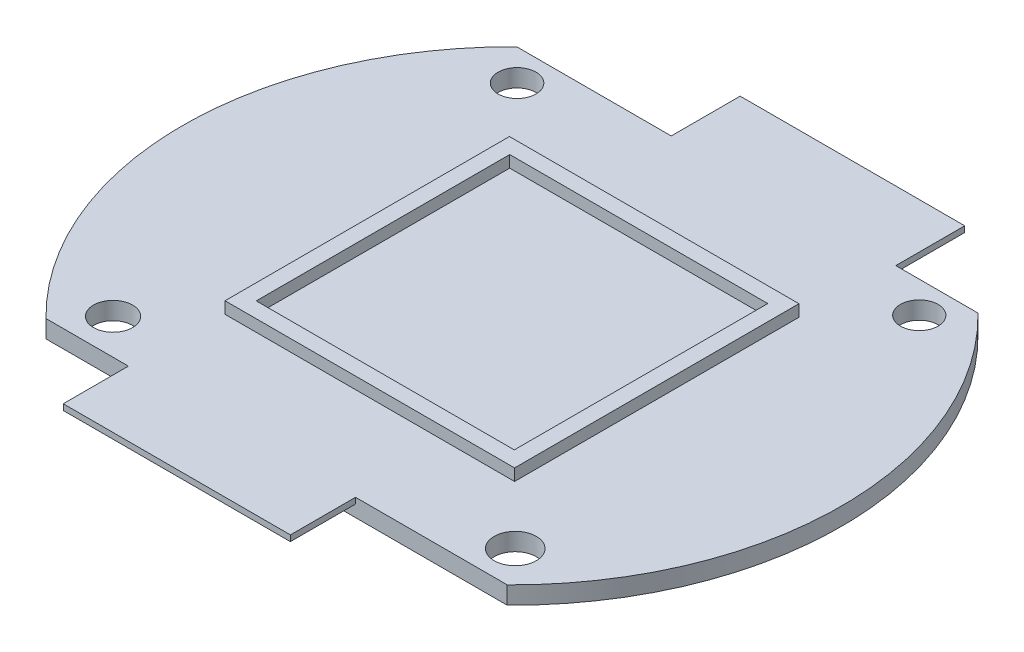
ISO-10303-21;
HEADER;
FILE_DESCRIPTION(('STEP AP214'),'2;1');
FILE_NAME('part.step','',(''),(''),'','','');
FILE_SCHEMA(('AUTOMOTIVE_DESIGN { 1 0 10303 214 1 1 1 1 }'));
ENDSEC;
DATA;
#1=APPLICATION_CONTEXT('core data for automotive mechanical design processes');
#2=APPLICATION_PROTOCOL_DEFINITION('international standard','automotive_design',2000,#1);
#3=PRODUCT_CONTEXT('',#1,'mechanical');
#4=PRODUCT('Part','Part','',(#3));
#5=PRODUCT_RELATED_PRODUCT_CATEGORY('part','',(#4));
#6=PRODUCT_DEFINITION_FORMATION('','',#4);
#7=PRODUCT_DEFINITION_CONTEXT('part definition',#1,'design');
#8=PRODUCT_DEFINITION('design','',#6,#7);
#9=PRODUCT_DEFINITION_SHAPE('','',#8);
#10=(LENGTH_UNIT() NAMED_UNIT(*) SI_UNIT(.MILLI.,.METRE.));
#11=(NAMED_UNIT(*) PLANE_ANGLE_UNIT() SI_UNIT($,.RADIAN.));
#12=(NAMED_UNIT(*) SI_UNIT($,.STERADIAN.) SOLID_ANGLE_UNIT());
#13=UNCERTAINTY_MEASURE_WITH_UNIT(LENGTH_MEASURE(1.E-05),#10,'distance_accuracy_value','');
#14=(GEOMETRIC_REPRESENTATION_CONTEXT(3) GLOBAL_UNCERTAINTY_ASSIGNED_CONTEXT((#13)) GLOBAL_UNIT_ASSIGNED_CONTEXT((#10,
#11,#12)) REPRESENTATION_CONTEXT('',''));
#15=CARTESIAN_POINT('',(0.,0.,0.));
#16=DIRECTION('',(0.,0.,1.));
#17=DIRECTION('',(1.,0.,0.));
#18=AXIS2_PLACEMENT_3D('',#15,#16,#17);
#19=CARTESIAN_POINT('',(28.,1.5,0.));
#20=DIRECTION('',(0.,1.,0.));
#21=DIRECTION('',(0.,0.,1.));
#22=AXIS2_PLACEMENT_3D('',#19,#20,#21);
#23=PLANE('',#22);
#24=CARTESIAN_POINT('',(45.2625847229335,1.5,-17.3430032205589));
#25=DIRECTION('',(0.,1.,0.));
#26=DIRECTION('',(0.,0.,1.));
#27=AXIS2_PLACEMENT_3D('',#24,#25,#26);
#28=CIRCLE('',#27,1.60091659940845);
#29=CARTESIAN_POINT('',(45.2625847229335,1.5,-15.7420866211505));
#30=VERTEX_POINT('',#29);
#31=EDGE_CURVE('E301',#30,#30,#28,.T.);
#32=ORIENTED_EDGE('',*,*,#31,.F.);
#33=EDGE_LOOP('',(#32));
#34=FACE_BOUND('',#33,.T.);
#35=CARTESIAN_POINT('',(11.0876517088964,1.5,16.987506119794));
#36=DIRECTION('',(0.,1.,0.));
#37=DIRECTION('',(0.,0.,1.));
#38=AXIS2_PLACEMENT_3D('',#35,#36,#37);
#39=CIRCLE('',#38,1.66029090967242);
#40=CARTESIAN_POINT('',(11.0876517088964,1.5,18.6477970294664));
#41=VERTEX_POINT('',#40);
#42=EDGE_CURVE('E313',#41,#41,#39,.T.);
#43=ORIENTED_EDGE('',*,*,#42,.F.);
#44=EDGE_LOOP('',(#43));
#45=FACE_BOUND('',#44,.T.);
#46=CARTESIAN_POINT('',(28.,1.5,0.));
#47=DIRECTION('',(0.,1.,0.));
#48=DIRECTION('',(0.,0.,1.));
#49=AXIS2_PLACEMENT_3D('',#46,#47,#48);
#50=CIRCLE('',#49,28.);
#51=CARTESIAN_POINT('',(47.5959179422654,1.5,20.));
#52=VERTEX_POINT('',#51);
#53=CARTESIAN_POINT('',(47.5959179422654,1.5,-20.));
#54=VERTEX_POINT('',#53);
#55=EDGE_CURVE('E325',#52,#54,#50,.T.);
#56=ORIENTED_EDGE('',*,*,#55,.T.);
#57=DIRECTION('',(-1.,0.,0.));
#58=VECTOR('',#57,1.);
#59=CARTESIAN_POINT('',(8.40408205773457,1.5,-20.));
#60=LINE('',#59,#58);
#61=CARTESIAN_POINT('',(40.6097951231648,1.5,-20.));
#62=VERTEX_POINT('',#61);
#63=EDGE_CURVE('E330',#54,#62,#60,.T.);
#64=ORIENTED_EDGE('',*,*,#63,.T.);
#65=DIRECTION('',(0.,0.,-1.));
#66=VECTOR('',#65,1.);
#67=CARTESIAN_POINT('',(40.6097951231648,1.5,-20.));
#68=LINE('',#67,#66);
#69=CARTESIAN_POINT('',(40.6097951231648,1.5,-25.8585508604194));
#70=VERTEX_POINT('',#69);
#71=EDGE_CURVE('E287',#62,#70,#68,.T.);
#72=ORIENTED_EDGE('',*,*,#71,.T.);
#73=DIRECTION('',(-1.,0.,0.));
#74=VECTOR('',#73,1.);
#75=CARTESIAN_POINT('',(21.5286032244424,1.5,-25.8585508604194));
#76=LINE('',#75,#74);
#77=CARTESIAN_POINT('',(21.5286032244424,1.5,-25.8585508604194));
#78=VERTEX_POINT('',#77);
#79=EDGE_CURVE('E275',#70,#78,#76,.T.);
#80=ORIENTED_EDGE('',*,*,#79,.T.);
#81=DIRECTION('',(0.,0.,1.));
#82=VECTOR('',#81,1.);
#83=CARTESIAN_POINT('',(21.5286032244424,1.5,-20.));
#84=LINE('',#83,#82);
#85=CARTESIAN_POINT('',(21.5286032244424,1.5,-20.));
#86=VERTEX_POINT('',#85);
#87=EDGE_CURVE('E264',#78,#86,#84,.T.);
#88=ORIENTED_EDGE('',*,*,#87,.T.);
#89=CARTESIAN_POINT('',(8.40408205773458,1.5,-20.));
#90=VERTEX_POINT('',#89);
#91=EDGE_CURVE('E328',#86,#90,#60,.T.);
#92=ORIENTED_EDGE('',*,*,#91,.T.);
#93=CARTESIAN_POINT('',(28.,1.5,0.));
#94=DIRECTION('',(0.,1.,0.));
#95=DIRECTION('',(0.,0.,1.));
#96=AXIS2_PLACEMENT_3D('',#93,#94,#95);
#97=CIRCLE('',#96,28.);
#98=CARTESIAN_POINT('',(8.40408205773457,1.5,20.));
#99=VERTEX_POINT('',#98);
#100=EDGE_CURVE('E333',#90,#99,#97,.T.);
#101=ORIENTED_EDGE('',*,*,#100,.T.);
#102=DIRECTION('',(1.,0.,0.));
#103=VECTOR('',#102,1.);
#104=CARTESIAN_POINT('',(8.40408205773457,1.5,20.));
#105=LINE('',#104,#103);
#106=CARTESIAN_POINT('',(15.4051261681188,1.5,20.));
#107=VERTEX_POINT('',#106);
#108=EDGE_CURVE('E336',#99,#107,#105,.T.);
#109=ORIENTED_EDGE('',*,*,#108,.T.);
#110=DIRECTION('',(0.,0.,1.));
#111=VECTOR('',#110,1.);
#112=CARTESIAN_POINT('',(15.4051261681188,1.5,20.));
#113=LINE('',#112,#111);
#114=CARTESIAN_POINT('',(15.4051261681188,1.5,25.5349172908674));
#115=VERTEX_POINT('',#114);
#116=EDGE_CURVE('E257',#107,#115,#113,.T.);
#117=ORIENTED_EDGE('',*,*,#116,.T.);
#118=DIRECTION('',(1.,0.,0.));
#119=VECTOR('',#118,1.);
#120=CARTESIAN_POINT('',(34.7050136759957,1.5,25.5349172908674));
#121=LINE('',#120,#119);
#122=CARTESIAN_POINT('',(34.7050136759957,1.5,25.5349172908674));
#123=VERTEX_POINT('',#122);
#124=EDGE_CURVE('E245',#115,#123,#121,.T.);
#125=ORIENTED_EDGE('',*,*,#124,.T.);
#126=DIRECTION('',(0.,0.,-1.));
#127=VECTOR('',#126,1.);
#128=CARTESIAN_POINT('',(34.7050136759957,1.5,20.));
#129=LINE('',#128,#127);
#130=CARTESIAN_POINT('',(34.7050136759957,1.5,20.));
#131=VERTEX_POINT('',#130);
#132=EDGE_CURVE('E240',#123,#131,#129,.T.);
#133=ORIENTED_EDGE('',*,*,#132,.T.);
#134=EDGE_CURVE('E335',#131,#52,#105,.T.);
#135=ORIENTED_EDGE('',*,*,#134,.T.);
#136=EDGE_LOOP('',(#56,#64,#72,#80,#88,#92,#101,#109,#117,#125,#133,#135));
#137=FACE_BOUND('',#136,.T.);
#138=CARTESIAN_POINT('',(11.0876517088964,1.5,-17.3430032205589));
#139=DIRECTION('',(0.,1.,0.));
#140=DIRECTION('',(0.,0.,1.));
#141=AXIS2_PLACEMENT_3D('',#138,#139,#140);
#142=CIRCLE('',#141,1.61012937888588);
#143=CARTESIAN_POINT('',(11.0876517088964,1.5,-15.7328738416731));
#144=VERTEX_POINT('',#143);
#145=EDGE_CURVE('E319',#144,#144,#142,.T.);
#146=ORIENTED_EDGE('',*,*,#145,.F.);
#147=EDGE_LOOP('',(#146));
#148=FACE_BOUND('',#147,.T.);
#149=CARTESIAN_POINT('',(45.2625847229335,1.5,16.987506119794));
#150=DIRECTION('',(0.,1.,0.));
#151=DIRECTION('',(0.,0.,1.));
#152=AXIS2_PLACEMENT_3D('',#149,#150,#151);
#153=CIRCLE('',#152,1.79119339543762);
#154=CARTESIAN_POINT('',(45.2625847229335,1.5,18.7786995152316));
#155=VERTEX_POINT('',#154);
#156=EDGE_CURVE('E307',#155,#155,#153,.T.);
#157=ORIENTED_EDGE('',*,*,#156,.F.);
#158=EDGE_LOOP('',(#157));
#159=FACE_BOUND('',#158,.T.);
#160=DIRECTION('',(-1.,0.,0.));
#161=VECTOR('',#160,1.);
#162=CARTESIAN_POINT('',(15.6990375609831,1.5,-12.0828669796844));
#163=LINE('',#162,#161);
#164=CARTESIAN_POINT('',(40.3009624390169,1.5,-12.0828669796844));
#165=VERTEX_POINT('',#164);
#166=CARTESIAN_POINT('',(15.6990375609831,1.5,-12.0828669796844));
#167=VERTEX_POINT('',#166);
#168=EDGE_CURVE('E227',#165,#167,#163,.T.);
#169=ORIENTED_EDGE('',*,*,#168,.F.);
#170=DIRECTION('',(0.,0.,-1.));
#171=VECTOR('',#170,1.);
#172=CARTESIAN_POINT('',(40.3009624390169,1.5,-12.0828669796844));
#173=LINE('',#172,#171);
#174=CARTESIAN_POINT('',(40.3009624390169,1.5,12.0828669796844));
#175=VERTEX_POINT('',#174);
#176=EDGE_CURVE('E192',#175,#165,#173,.T.);
#177=ORIENTED_EDGE('',*,*,#176,.F.);
#178=DIRECTION('',(1.,0.,0.));
#179=VECTOR('',#178,1.);
#180=CARTESIAN_POINT('',(15.6990375609831,1.5,12.0828669796844));
#181=LINE('',#180,#179);
#182=CARTESIAN_POINT('',(15.6990375609831,1.5,12.0828669796844));
#183=VERTEX_POINT('',#182);
#184=EDGE_CURVE('E218',#183,#175,#181,.T.);
#185=ORIENTED_EDGE('',*,*,#184,.F.);
#186=DIRECTION('',(0.,0.,1.));
#187=VECTOR('',#186,1.);
#188=CARTESIAN_POINT('',(15.6990375609831,1.5,-12.0828669796844));
#189=LINE('',#188,#187);
#190=EDGE_CURVE('E229',#167,#183,#189,.T.);
#191=ORIENTED_EDGE('',*,*,#190,.F.);
#192=EDGE_LOOP('',(#169,#177,#185,#191));
#193=FACE_BOUND('',#192,.T.);
#194=ADVANCED_FACE('F36',(#34,#45,#137,#148,#159,#193),#23,.T.);
#195=CARTESIAN_POINT('',(8.40408205773457,1.5,20.));
#196=DIRECTION('',(0.,0.,-1.));
#197=DIRECTION('',(-1.,0.,0.));
#198=AXIS2_PLACEMENT_3D('',#195,#196,#197);
#199=PLANE('',#198);
#200=DIRECTION('',(0.,1.,0.));
#201=VECTOR('',#200,1.);
#202=CARTESIAN_POINT('',(34.7050136759957,1.,20.));
#203=LINE('',#202,#201);
#204=CARTESIAN_POINT('',(34.7050136759957,1.,20.));
#205=VERTEX_POINT('',#204);
#206=EDGE_CURVE('E254',#205,#131,#203,.T.);
#207=ORIENTED_EDGE('',*,*,#206,.F.);
#208=DIRECTION('',(-1.,0.,0.));
#209=VECTOR('',#208,1.);
#210=CARTESIAN_POINT('',(34.7050136759957,1.,20.));
#211=LINE('',#210,#209);
#212=CARTESIAN_POINT('',(15.4051261681188,1.,20.));
#213=VERTEX_POINT('',#212);
#214=EDGE_CURVE('E244',#205,#213,#211,.T.);
#215=ORIENTED_EDGE('',*,*,#214,.T.);
#216=DIRECTION('',(0.,1.,0.));
#217=VECTOR('',#216,1.);
#218=CARTESIAN_POINT('',(15.4051261681188,1.,20.));
#219=LINE('',#218,#217);
#220=EDGE_CURVE('E267',#213,#107,#219,.T.);
#221=ORIENTED_EDGE('',*,*,#220,.T.);
#222=ORIENTED_EDGE('',*,*,#108,.F.);
#223=DIRECTION('',(0.,-1.,0.));
#224=VECTOR('',#223,1.);
#225=CARTESIAN_POINT('',(8.40408205773457,1.5,20.));
#226=LINE('',#225,#224);
#227=CARTESIAN_POINT('',(8.40408205773457,0.,20.));
#228=VERTEX_POINT('',#227);
#229=EDGE_CURVE('E349',#99,#228,#226,.T.);
#230=ORIENTED_EDGE('',*,*,#229,.T.);
#231=DIRECTION('',(1.,0.,0.));
#232=VECTOR('',#231,1.);
#233=CARTESIAN_POINT('',(8.40408205773457,0.,20.));
#234=LINE('',#233,#232);
#235=CARTESIAN_POINT('',(47.5959179422654,0.,20.));
#236=VERTEX_POINT('',#235);
#237=EDGE_CURVE('E329',#228,#236,#234,.T.);
#238=ORIENTED_EDGE('',*,*,#237,.T.);
#239=DIRECTION('',(0.,-1.,0.));
#240=VECTOR('',#239,1.);
#241=CARTESIAN_POINT('',(47.5959179422654,1.5,20.));
#242=LINE('',#241,#240);
#243=EDGE_CURVE('E339',#52,#236,#242,.T.);
#244=ORIENTED_EDGE('',*,*,#243,.F.);
#245=ORIENTED_EDGE('',*,*,#134,.F.);
#246=EDGE_LOOP('',(#207,#215,#221,#222,#230,#238,#244,#245));
#247=FACE_BOUND('',#246,.T.);
#248=ADVANCED_FACE('F368',(#247),#199,.F.);
#249=CARTESIAN_POINT('',(8.40408205773457,1.5,-20.));
#250=DIRECTION('',(0.,0.,1.));
#251=DIRECTION('',(1.,0.,0.));
#252=AXIS2_PLACEMENT_3D('',#249,#250,#251);
#253=PLANE('',#252);
#254=DIRECTION('',(0.,1.,0.));
#255=VECTOR('',#254,1.);
#256=CARTESIAN_POINT('',(21.5286032244424,1.,-20.));
#257=LINE('',#256,#255);
#258=CARTESIAN_POINT('',(21.5286032244424,1.,-20.));
#259=VERTEX_POINT('',#258);
#260=EDGE_CURVE('E284',#259,#86,#257,.T.);
#261=ORIENTED_EDGE('',*,*,#260,.F.);
#262=DIRECTION('',(1.,0.,0.));
#263=VECTOR('',#262,1.);
#264=CARTESIAN_POINT('',(21.5286032244424,1.,-20.));
#265=LINE('',#264,#263);
#266=CARTESIAN_POINT('',(40.6097951231648,1.,-20.));
#267=VERTEX_POINT('',#266);
#268=EDGE_CURVE('E274',#259,#267,#265,.T.);
#269=ORIENTED_EDGE('',*,*,#268,.T.);
#270=DIRECTION('',(0.,1.,0.));
#271=VECTOR('',#270,1.);
#272=CARTESIAN_POINT('',(40.6097951231648,1.,-20.));
#273=LINE('',#272,#271);
#274=EDGE_CURVE('E297',#267,#62,#273,.T.);
#275=ORIENTED_EDGE('',*,*,#274,.T.);
#276=ORIENTED_EDGE('',*,*,#63,.F.);
#277=DIRECTION('',(0.,-1.,0.));
#278=VECTOR('',#277,1.);
#279=CARTESIAN_POINT('',(47.5959179422654,1.5,-20.));
#280=LINE('',#279,#278);
#281=CARTESIAN_POINT('',(47.5959179422654,0.,-20.));
#282=VERTEX_POINT('',#281);
#283=EDGE_CURVE('E11',#54,#282,#280,.T.);
#284=ORIENTED_EDGE('',*,*,#283,.T.);
#285=DIRECTION('',(-1.,0.,0.));
#286=VECTOR('',#285,1.);
#287=CARTESIAN_POINT('',(8.40408205773457,0.,-20.));
#288=LINE('',#287,#286);
#289=CARTESIAN_POINT('',(8.40408205773458,0.,-20.));
#290=VERTEX_POINT('',#289);
#291=EDGE_CURVE('E342',#282,#290,#288,.T.);
#292=ORIENTED_EDGE('',*,*,#291,.T.);
#293=DIRECTION('',(0.,-1.,0.));
#294=VECTOR('',#293,1.);
#295=CARTESIAN_POINT('',(8.40408205773458,1.5,-20.));
#296=LINE('',#295,#294);
#297=EDGE_CURVE('E44',#90,#290,#296,.T.);
#298=ORIENTED_EDGE('',*,*,#297,.F.);
#299=ORIENTED_EDGE('',*,*,#91,.F.);
#300=EDGE_LOOP('',(#261,#269,#275,#276,#284,#292,#298,#299));
#301=FACE_BOUND('',#300,.T.);
#302=ADVANCED_FACE('F391',(#301),#253,.F.);
#303=CARTESIAN_POINT('',(28.,0.,0.));
#304=DIRECTION('',(0.,1.,0.));
#305=DIRECTION('',(0.,0.,1.));
#306=AXIS2_PLACEMENT_3D('',#303,#304,#305);
#307=PLANE('',#306);
#308=CARTESIAN_POINT('',(28.,0.,0.));
#309=DIRECTION('',(0.,1.,0.));
#310=DIRECTION('',(0.,0.,1.));
#311=AXIS2_PLACEMENT_3D('',#308,#309,#310);
#312=CIRCLE('',#311,28.);
#313=EDGE_CURVE('E322',#236,#282,#312,.T.);
#314=ORIENTED_EDGE('',*,*,#313,.F.);
#315=ORIENTED_EDGE('',*,*,#237,.F.);
#316=CARTESIAN_POINT('',(28.,0.,0.));
#317=DIRECTION('',(0.,1.,0.));
#318=DIRECTION('',(0.,0.,1.));
#319=AXIS2_PLACEMENT_3D('',#316,#317,#318);
#320=CIRCLE('',#319,28.);
#321=EDGE_CURVE('E344',#290,#228,#320,.T.);
#322=ORIENTED_EDGE('',*,*,#321,.F.);
#323=ORIENTED_EDGE('',*,*,#291,.F.);
#324=EDGE_LOOP('',(#314,#315,#322,#323));
#325=FACE_BOUND('',#324,.T.);
#326=CARTESIAN_POINT('',(11.0876517088964,0.,-17.3430032205589));
#327=DIRECTION('',(0.,1.,0.));
#328=DIRECTION('',(0.,0.,1.));
#329=AXIS2_PLACEMENT_3D('',#326,#327,#328);
#330=CIRCLE('',#329,1.61012937888588);
#331=CARTESIAN_POINT('',(11.0876517088964,0.,-15.7328738416731));
#332=VERTEX_POINT('',#331);
#333=EDGE_CURVE('E316',#332,#332,#330,.T.);
#334=ORIENTED_EDGE('',*,*,#333,.T.);
#335=EDGE_LOOP('',(#334));
#336=FACE_BOUND('',#335,.T.);
#337=CARTESIAN_POINT('',(11.0876517088964,0.,16.987506119794));
#338=DIRECTION('',(0.,1.,0.));
#339=DIRECTION('',(0.,0.,1.));
#340=AXIS2_PLACEMENT_3D('',#337,#338,#339);
#341=CIRCLE('',#340,1.66029090967242);
#342=CARTESIAN_POINT('',(11.0876517088964,0.,18.6477970294664));
#343=VERTEX_POINT('',#342);
#344=EDGE_CURVE('E310',#343,#343,#341,.T.);
#345=ORIENTED_EDGE('',*,*,#344,.T.);
#346=EDGE_LOOP('',(#345));
#347=FACE_BOUND('',#346,.T.);
#348=CARTESIAN_POINT('',(45.2625847229335,0.,16.987506119794));
#349=DIRECTION('',(0.,1.,0.));
#350=DIRECTION('',(0.,0.,1.));
#351=AXIS2_PLACEMENT_3D('',#348,#349,#350);
#352=CIRCLE('',#351,1.79119339543762);
#353=CARTESIAN_POINT('',(45.2625847229335,0.,18.7786995152316));
#354=VERTEX_POINT('',#353);
#355=EDGE_CURVE('E304',#354,#354,#352,.T.);
#356=ORIENTED_EDGE('',*,*,#355,.T.);
#357=EDGE_LOOP('',(#356));
#358=FACE_BOUND('',#357,.T.);
#359=CARTESIAN_POINT('',(45.2625847229335,0.,-17.3430032205589));
#360=DIRECTION('',(0.,1.,0.));
#361=DIRECTION('',(0.,0.,1.));
#362=AXIS2_PLACEMENT_3D('',#359,#360,#361);
#363=CIRCLE('',#362,1.60091659940845);
#364=CARTESIAN_POINT('',(45.2625847229335,0.,-15.7420866211505));
#365=VERTEX_POINT('',#364);
#366=EDGE_CURVE('E294',#365,#365,#363,.T.);
#367=ORIENTED_EDGE('',*,*,#366,.T.);
#368=EDGE_LOOP('',(#367));
#369=FACE_BOUND('',#368,.T.);
#370=ADVANCED_FACE('F363',(#325,#336,#347,#358,#369),#307,.F.);
#371=CARTESIAN_POINT('',(28.,1.5,0.));
#372=DIRECTION('',(0.,-1.,0.));
#373=DIRECTION('',(0.,0.,-1.));
#374=AXIS2_PLACEMENT_3D('',#371,#372,#373);
#375=CYLINDRICAL_SURFACE('',#374,28.);
#376=ORIENTED_EDGE('',*,*,#313,.T.);
#377=ORIENTED_EDGE('',*,*,#283,.F.);
#378=ORIENTED_EDGE('',*,*,#55,.F.);
#379=ORIENTED_EDGE('',*,*,#243,.T.);
#380=EDGE_LOOP('',(#376,#377,#378,#379));
#381=FACE_BOUND('',#380,.T.);
#382=ADVANCED_FACE('F38',(#381),#375,.T.);
#383=CARTESIAN_POINT('',(28.,1.5,0.));
#384=DIRECTION('',(0.,-1.,0.));
#385=DIRECTION('',(0.,0.,-1.));
#386=AXIS2_PLACEMENT_3D('',#383,#384,#385);
#387=CYLINDRICAL_SURFACE('',#386,28.);
#388=ORIENTED_EDGE('',*,*,#321,.T.);
#389=ORIENTED_EDGE('',*,*,#229,.F.);
#390=ORIENTED_EDGE('',*,*,#100,.F.);
#391=ORIENTED_EDGE('',*,*,#297,.T.);
#392=EDGE_LOOP('',(#388,#389,#390,#391));
#393=FACE_BOUND('',#392,.T.);
#394=ADVANCED_FACE('F356',(#393),#387,.T.);
#395=CARTESIAN_POINT('',(11.0876517088964,1.5,-17.3430032205589));
#396=DIRECTION('',(0.,-1.,0.));
#397=DIRECTION('',(0.,0.,-1.));
#398=AXIS2_PLACEMENT_3D('',#395,#396,#397);
#399=CYLINDRICAL_SURFACE('',#398,1.61012937888588);
#400=ORIENTED_EDGE('',*,*,#145,.T.);
#401=EDGE_LOOP('',(#400));
#402=FACE_BOUND('',#401,.T.);
#403=ORIENTED_EDGE('',*,*,#333,.F.);
#404=EDGE_LOOP('',(#403));
#405=FACE_BOUND('',#404,.T.);
#406=ADVANCED_FACE('F612',(#402,#405),#399,.F.);
#407=CARTESIAN_POINT('',(11.0876517088964,1.5,16.987506119794));
#408=DIRECTION('',(0.,-1.,0.));
#409=DIRECTION('',(0.,0.,-1.));
#410=AXIS2_PLACEMENT_3D('',#407,#408,#409);
#411=CYLINDRICAL_SURFACE('',#410,1.66029090967242);
#412=ORIENTED_EDGE('',*,*,#42,.T.);
#413=EDGE_LOOP('',(#412));
#414=FACE_BOUND('',#413,.T.);
#415=ORIENTED_EDGE('',*,*,#344,.F.);
#416=EDGE_LOOP('',(#415));
#417=FACE_BOUND('',#416,.T.);
#418=ADVANCED_FACE('F604',(#414,#417),#411,.F.);
#419=CARTESIAN_POINT('',(45.2625847229335,1.5,16.987506119794));
#420=DIRECTION('',(0.,-1.,0.));
#421=DIRECTION('',(0.,0.,-1.));
#422=AXIS2_PLACEMENT_3D('',#419,#420,#421);
#423=CYLINDRICAL_SURFACE('',#422,1.79119339543762);
#424=ORIENTED_EDGE('',*,*,#156,.T.);
#425=EDGE_LOOP('',(#424));
#426=FACE_BOUND('',#425,.T.);
#427=ORIENTED_EDGE('',*,*,#355,.F.);
#428=EDGE_LOOP('',(#427));
#429=FACE_BOUND('',#428,.T.);
#430=ADVANCED_FACE('F595',(#426,#429),#423,.F.);
#431=CARTESIAN_POINT('',(45.2625847229335,1.5,-17.3430032205589));
#432=DIRECTION('',(0.,-1.,0.));
#433=DIRECTION('',(0.,0.,-1.));
#434=AXIS2_PLACEMENT_3D('',#431,#432,#433);
#435=CYLINDRICAL_SURFACE('',#434,1.60091659940845);
#436=ORIENTED_EDGE('',*,*,#31,.T.);
#437=EDGE_LOOP('',(#436));
#438=FACE_BOUND('',#437,.T.);
#439=ORIENTED_EDGE('',*,*,#366,.F.);
#440=EDGE_LOOP('',(#439));
#441=FACE_BOUND('',#440,.T.);
#442=ADVANCED_FACE('F542',(#438,#441),#435,.F.);
#443=CARTESIAN_POINT('',(21.5286032244424,1.,-20.));
#444=DIRECTION('',(-1.,0.,0.));
#445=DIRECTION('',(0.,0.,1.));
#446=AXIS2_PLACEMENT_3D('',#443,#444,#445);
#447=PLANE('',#446);
#448=ORIENTED_EDGE('',*,*,#87,.F.);
#449=DIRECTION('',(0.,1.,0.));
#450=VECTOR('',#449,1.);
#451=CARTESIAN_POINT('',(21.5286032244424,1.,-25.8585508604194));
#452=LINE('',#451,#450);
#453=CARTESIAN_POINT('',(21.5286032244424,1.,-25.8585508604194));
#454=VERTEX_POINT('',#453);
#455=EDGE_CURVE('E292',#454,#78,#452,.T.);
#456=ORIENTED_EDGE('',*,*,#455,.F.);
#457=DIRECTION('',(0.,0.,1.));
#458=VECTOR('',#457,1.);
#459=CARTESIAN_POINT('',(21.5286032244424,1.,-20.));
#460=LINE('',#459,#458);
#461=EDGE_CURVE('E271',#454,#259,#460,.T.);
#462=ORIENTED_EDGE('',*,*,#461,.T.);
#463=ORIENTED_EDGE('',*,*,#260,.T.);
#464=EDGE_LOOP('',(#448,#456,#462,#463));
#465=FACE_BOUND('',#464,.T.);
#466=ADVANCED_FACE('F393',(#465),#447,.T.);
#467=CARTESIAN_POINT('',(21.5286032244424,1.,-25.8585508604194));
#468=DIRECTION('',(0.,0.,-1.));
#469=DIRECTION('',(-1.,0.,0.));
#470=AXIS2_PLACEMENT_3D('',#467,#468,#469);
#471=PLANE('',#470);
#472=ORIENTED_EDGE('',*,*,#79,.F.);
#473=DIRECTION('',(0.,1.,0.));
#474=VECTOR('',#473,1.);
#475=CARTESIAN_POINT('',(40.6097951231648,1.,-25.8585508604194));
#476=LINE('',#475,#474);
#477=CARTESIAN_POINT('',(40.6097951231648,1.,-25.8585508604194));
#478=VERTEX_POINT('',#477);
#479=EDGE_CURVE('E295',#478,#70,#476,.T.);
#480=ORIENTED_EDGE('',*,*,#479,.F.);
#481=DIRECTION('',(-1.,0.,0.));
#482=VECTOR('',#481,1.);
#483=CARTESIAN_POINT('',(21.5286032244424,1.,-25.8585508604194));
#484=LINE('',#483,#482);
#485=EDGE_CURVE('E281',#478,#454,#484,.T.);
#486=ORIENTED_EDGE('',*,*,#485,.T.);
#487=ORIENTED_EDGE('',*,*,#455,.T.);
#488=EDGE_LOOP('',(#472,#480,#486,#487));
#489=FACE_BOUND('',#488,.T.);
#490=ADVANCED_FACE('F401',(#489),#471,.T.);
#491=CARTESIAN_POINT('',(40.6097951231648,1.,-20.));
#492=DIRECTION('',(1.,0.,0.));
#493=DIRECTION('',(0.,0.,-1.));
#494=AXIS2_PLACEMENT_3D('',#491,#492,#493);
#495=PLANE('',#494);
#496=ORIENTED_EDGE('',*,*,#71,.F.);
#497=ORIENTED_EDGE('',*,*,#274,.F.);
#498=DIRECTION('',(0.,0.,-1.));
#499=VECTOR('',#498,1.);
#500=CARTESIAN_POINT('',(40.6097951231648,1.,-20.));
#501=LINE('',#500,#499);
#502=EDGE_CURVE('E278',#267,#478,#501,.T.);
#503=ORIENTED_EDGE('',*,*,#502,.T.);
#504=ORIENTED_EDGE('',*,*,#479,.T.);
#505=EDGE_LOOP('',(#496,#497,#503,#504));
#506=FACE_BOUND('',#505,.T.);
#507=ADVANCED_FACE('F403',(#506),#495,.T.);
#508=CARTESIAN_POINT('',(0.,1.,0.));
#509=DIRECTION('',(0.,-1.,0.));
#510=DIRECTION('',(0.,0.,-1.));
#511=AXIS2_PLACEMENT_3D('',#508,#509,#510);
#512=PLANE('',#511);
#513=ORIENTED_EDGE('',*,*,#461,.F.);
#514=ORIENTED_EDGE('',*,*,#485,.F.);
#515=ORIENTED_EDGE('',*,*,#502,.F.);
#516=ORIENTED_EDGE('',*,*,#268,.F.);
#517=EDGE_LOOP('',(#513,#514,#515,#516));
#518=FACE_BOUND('',#517,.T.);
#519=ADVANCED_FACE('F397',(#518),#512,.T.);
#520=CARTESIAN_POINT('',(34.7050136759957,1.,20.));
#521=DIRECTION('',(1.,0.,0.));
#522=DIRECTION('',(0.,0.,-1.));
#523=AXIS2_PLACEMENT_3D('',#520,#521,#522);
#524=PLANE('',#523);
#525=ORIENTED_EDGE('',*,*,#132,.F.);
#526=DIRECTION('',(0.,1.,0.));
#527=VECTOR('',#526,1.);
#528=CARTESIAN_POINT('',(34.7050136759957,1.,25.5349172908674));
#529=LINE('',#528,#527);
#530=CARTESIAN_POINT('',(34.7050136759957,1.,25.5349172908674));
#531=VERTEX_POINT('',#530);
#532=EDGE_CURVE('E262',#531,#123,#529,.T.);
#533=ORIENTED_EDGE('',*,*,#532,.F.);
#534=DIRECTION('',(0.,0.,-1.));
#535=VECTOR('',#534,1.);
#536=CARTESIAN_POINT('',(34.7050136759957,1.,20.));
#537=LINE('',#536,#535);
#538=EDGE_CURVE('E241',#531,#205,#537,.T.);
#539=ORIENTED_EDGE('',*,*,#538,.T.);
#540=ORIENTED_EDGE('',*,*,#206,.T.);
#541=EDGE_LOOP('',(#525,#533,#539,#540));
#542=FACE_BOUND('',#541,.T.);
#543=ADVANCED_FACE('F378',(#542),#524,.T.);
#544=CARTESIAN_POINT('',(34.7050136759957,1.,25.5349172908674));
#545=DIRECTION('',(0.,0.,1.));
#546=DIRECTION('',(1.,0.,0.));
#547=AXIS2_PLACEMENT_3D('',#544,#545,#546);
#548=PLANE('',#547);
#549=ORIENTED_EDGE('',*,*,#124,.F.);
#550=DIRECTION('',(0.,1.,0.));
#551=VECTOR('',#550,1.);
#552=CARTESIAN_POINT('',(15.4051261681188,1.,25.5349172908674));
#553=LINE('',#552,#551);
#554=CARTESIAN_POINT('',(15.4051261681188,1.,25.5349172908674));
#555=VERTEX_POINT('',#554);
#556=EDGE_CURVE('E265',#555,#115,#553,.T.);
#557=ORIENTED_EDGE('',*,*,#556,.F.);
#558=DIRECTION('',(1.,0.,0.));
#559=VECTOR('',#558,1.);
#560=CARTESIAN_POINT('',(34.7050136759957,1.,25.5349172908674));
#561=LINE('',#560,#559);
#562=EDGE_CURVE('E251',#555,#531,#561,.T.);
#563=ORIENTED_EDGE('',*,*,#562,.T.);
#564=ORIENTED_EDGE('',*,*,#532,.T.);
#565=EDGE_LOOP('',(#549,#557,#563,#564));
#566=FACE_BOUND('',#565,.T.);
#567=ADVANCED_FACE('F386',(#566),#548,.T.);
#568=CARTESIAN_POINT('',(15.4051261681188,1.,20.));
#569=DIRECTION('',(-1.,0.,0.));
#570=DIRECTION('',(0.,0.,1.));
#571=AXIS2_PLACEMENT_3D('',#568,#569,#570);
#572=PLANE('',#571);
#573=ORIENTED_EDGE('',*,*,#116,.F.);
#574=ORIENTED_EDGE('',*,*,#220,.F.);
#575=DIRECTION('',(0.,0.,1.));
#576=VECTOR('',#575,1.);
#577=CARTESIAN_POINT('',(15.4051261681188,1.,20.));
#578=LINE('',#577,#576);
#579=EDGE_CURVE('E248',#213,#555,#578,.T.);
#580=ORIENTED_EDGE('',*,*,#579,.T.);
#581=ORIENTED_EDGE('',*,*,#556,.T.);
#582=EDGE_LOOP('',(#573,#574,#580,#581));
#583=FACE_BOUND('',#582,.T.);
#584=ADVANCED_FACE('F388',(#583),#572,.T.);
#585=CARTESIAN_POINT('',(0.,1.,0.));
#586=DIRECTION('',(0.,-1.,0.));
#587=DIRECTION('',(0.,0.,-1.));
#588=AXIS2_PLACEMENT_3D('',#585,#586,#587);
#589=PLANE('',#588);
#590=ORIENTED_EDGE('',*,*,#538,.F.);
#591=ORIENTED_EDGE('',*,*,#562,.F.);
#592=ORIENTED_EDGE('',*,*,#579,.F.);
#593=ORIENTED_EDGE('',*,*,#214,.F.);
#594=EDGE_LOOP('',(#590,#591,#592,#593));
#595=FACE_BOUND('',#594,.T.);
#596=ADVANCED_FACE('F382',(#595),#589,.T.);
#597=CARTESIAN_POINT('',(0.,2.5,0.));
#598=DIRECTION('',(0.,1.,0.));
#599=DIRECTION('',(0.,0.,1.));
#600=AXIS2_PLACEMENT_3D('',#597,#598,#599);
#601=PLANE('',#600);
#602=DIRECTION('',(0.,0.,-1.));
#603=VECTOR('',#602,1.);
#604=CARTESIAN_POINT('',(40.3009624390169,2.5,-12.0828669796844));
#605=LINE('',#604,#603);
#606=CARTESIAN_POINT('',(40.3009624390169,2.5,12.0828669796844));
#607=VERTEX_POINT('',#606);
#608=CARTESIAN_POINT('',(40.3009624390169,2.5,-12.0828669796844));
#609=VERTEX_POINT('',#608);
#610=EDGE_CURVE('E214',#607,#609,#605,.T.);
#611=ORIENTED_EDGE('',*,*,#610,.T.);
#612=DIRECTION('',(-1.,0.,0.));
#613=VECTOR('',#612,1.);
#614=CARTESIAN_POINT('',(15.6990375609831,2.5,-12.0828669796844));
#615=LINE('',#614,#613);
#616=CARTESIAN_POINT('',(15.6990375609831,2.5,-12.0828669796844));
#617=VERTEX_POINT('',#616);
#618=EDGE_CURVE('E217',#609,#617,#615,.T.);
#619=ORIENTED_EDGE('',*,*,#618,.T.);
#620=DIRECTION('',(0.,0.,1.));
#621=VECTOR('',#620,1.);
#622=CARTESIAN_POINT('',(15.6990375609831,2.5,-12.0828669796844));
#623=LINE('',#622,#621);
#624=CARTESIAN_POINT('',(15.6990375609831,2.5,12.0828669796844));
#625=VERTEX_POINT('',#624);
#626=EDGE_CURVE('E220',#617,#625,#623,.T.);
#627=ORIENTED_EDGE('',*,*,#626,.T.);
#628=DIRECTION('',(1.,0.,0.));
#629=VECTOR('',#628,1.);
#630=CARTESIAN_POINT('',(15.6990375609831,2.5,12.0828669796844));
#631=LINE('',#630,#629);
#632=EDGE_CURVE('E222',#625,#607,#631,.T.);
#633=ORIENTED_EDGE('',*,*,#632,.T.);
#634=EDGE_LOOP('',(#611,#619,#627,#633));
#635=FACE_BOUND('',#634,.T.);
#636=DIRECTION('',(-1.,0.,0.));
#637=VECTOR('',#636,1.);
#638=CARTESIAN_POINT('',(17.0365299277125,2.5,-10.7690882868664));
#639=LINE('',#638,#637);
#640=CARTESIAN_POINT('',(38.9634700722874,2.5,-10.7690882868664));
#641=VERTEX_POINT('',#640);
#642=CARTESIAN_POINT('',(17.0365299277125,2.5,-10.7690882868664));
#643=VERTEX_POINT('',#642);
#644=EDGE_CURVE('E184',#641,#643,#639,.T.);
#645=ORIENTED_EDGE('',*,*,#644,.F.);
#646=DIRECTION('',(0.,0.,-1.));
#647=VECTOR('',#646,1.);
#648=CARTESIAN_POINT('',(38.9634700722874,2.5,-10.7690882868664));
#649=LINE('',#648,#647);
#650=CARTESIAN_POINT('',(38.9634700722874,2.5,10.7690882868664));
#651=VERTEX_POINT('',#650);
#652=EDGE_CURVE('E175',#651,#641,#649,.T.);
#653=ORIENTED_EDGE('',*,*,#652,.F.);
#654=DIRECTION('',(1.,0.,0.));
#655=VECTOR('',#654,1.);
#656=CARTESIAN_POINT('',(17.0365299277125,2.5,10.7690882868664));
#657=LINE('',#656,#655);
#658=CARTESIAN_POINT('',(17.0365299277125,2.5,10.7690882868664));
#659=VERTEX_POINT('',#658);
#660=EDGE_CURVE('E200',#659,#651,#657,.T.);
#661=ORIENTED_EDGE('',*,*,#660,.F.);
#662=DIRECTION('',(0.,0.,1.));
#663=VECTOR('',#662,1.);
#664=CARTESIAN_POINT('',(17.0365299277125,2.5,-10.7690882868664));
#665=LINE('',#664,#663);
#666=EDGE_CURVE('E198',#643,#659,#665,.T.);
#667=ORIENTED_EDGE('',*,*,#666,.F.);
#668=EDGE_LOOP('',(#645,#653,#661,#667));
#669=FACE_BOUND('',#668,.T.);
#670=ADVANCED_FACE('F196',(#635,#669),#601,.T.);
#671=CARTESIAN_POINT('',(40.3009624390169,2.5,-12.0828669796844));
#672=DIRECTION('',(-1.,0.,0.));
#673=DIRECTION('',(0.,0.,1.));
#674=AXIS2_PLACEMENT_3D('',#671,#672,#673);
#675=PLANE('',#674);
#676=ORIENTED_EDGE('',*,*,#176,.T.);
#677=DIRECTION('',(0.,-1.,0.));
#678=VECTOR('',#677,1.);
#679=CARTESIAN_POINT('',(40.3009624390169,2.5,-12.0828669796844));
#680=LINE('',#679,#678);
#681=EDGE_CURVE('E238',#609,#165,#680,.T.);
#682=ORIENTED_EDGE('',*,*,#681,.F.);
#683=ORIENTED_EDGE('',*,*,#610,.F.);
#684=DIRECTION('',(0.,-1.,0.));
#685=VECTOR('',#684,1.);
#686=CARTESIAN_POINT('',(40.3009624390169,2.5,12.0828669796844));
#687=LINE('',#686,#685);
#688=EDGE_CURVE('E224',#607,#175,#687,.T.);
#689=ORIENTED_EDGE('',*,*,#688,.T.);
#690=EDGE_LOOP('',(#676,#682,#683,#689));
#691=FACE_BOUND('',#690,.T.);
#692=ADVANCED_FACE('F447',(#691),#675,.F.);
#693=CARTESIAN_POINT('',(15.6990375609831,2.5,-12.0828669796844));
#694=DIRECTION('',(0.,0.,1.));
#695=DIRECTION('',(1.,0.,0.));
#696=AXIS2_PLACEMENT_3D('',#693,#694,#695);
#697=PLANE('',#696);
#698=ORIENTED_EDGE('',*,*,#168,.T.);
#699=DIRECTION('',(0.,-1.,0.));
#700=VECTOR('',#699,1.);
#701=CARTESIAN_POINT('',(15.6990375609831,2.5,-12.0828669796844));
#702=LINE('',#701,#700);
#703=EDGE_CURVE('E235',#617,#167,#702,.T.);
#704=ORIENTED_EDGE('',*,*,#703,.F.);
#705=ORIENTED_EDGE('',*,*,#618,.F.);
#706=ORIENTED_EDGE('',*,*,#681,.T.);
#707=EDGE_LOOP('',(#698,#704,#705,#706));
#708=FACE_BOUND('',#707,.T.);
#709=ADVANCED_FACE('F454',(#708),#697,.F.);
#710=CARTESIAN_POINT('',(15.6990375609831,2.5,-12.0828669796844));
#711=DIRECTION('',(1.,0.,0.));
#712=DIRECTION('',(0.,0.,-1.));
#713=AXIS2_PLACEMENT_3D('',#710,#711,#712);
#714=PLANE('',#713);
#715=ORIENTED_EDGE('',*,*,#190,.T.);
#716=DIRECTION('',(0.,-1.,0.));
#717=VECTOR('',#716,1.);
#718=CARTESIAN_POINT('',(15.6990375609831,2.5,12.0828669796844));
#719=LINE('',#718,#717);
#720=EDGE_CURVE('E51',#625,#183,#719,.T.);
#721=ORIENTED_EDGE('',*,*,#720,.F.);
#722=ORIENTED_EDGE('',*,*,#626,.F.);
#723=ORIENTED_EDGE('',*,*,#703,.T.);
#724=EDGE_LOOP('',(#715,#721,#722,#723));
#725=FACE_BOUND('',#724,.T.);
#726=ADVANCED_FACE('F451',(#725),#714,.F.);
#727=CARTESIAN_POINT('',(15.6990375609831,2.5,12.0828669796844));
#728=DIRECTION('',(0.,0.,-1.));
#729=DIRECTION('',(-1.,0.,0.));
#730=AXIS2_PLACEMENT_3D('',#727,#728,#729);
#731=PLANE('',#730);
#732=ORIENTED_EDGE('',*,*,#184,.T.);
#733=ORIENTED_EDGE('',*,*,#688,.F.);
#734=ORIENTED_EDGE('',*,*,#632,.F.);
#735=ORIENTED_EDGE('',*,*,#720,.T.);
#736=EDGE_LOOP('',(#732,#733,#734,#735));
#737=FACE_BOUND('',#736,.T.);
#738=ADVANCED_FACE('F444',(#737),#731,.F.);
#739=CARTESIAN_POINT('',(38.9634700722874,2.5,-10.7690882868664));
#740=DIRECTION('',(-1.,0.,0.));
#741=DIRECTION('',(0.,0.,1.));
#742=AXIS2_PLACEMENT_3D('',#739,#740,#741);
#743=PLANE('',#742);
#744=DIRECTION('',(0.,0.,-1.));
#745=VECTOR('',#744,1.);
#746=CARTESIAN_POINT('',(38.9634700722874,1.5,-10.7690882868664));
#747=LINE('',#746,#745);
#748=CARTESIAN_POINT('',(38.9634700722874,1.5,10.7690882868664));
#749=VERTEX_POINT('',#748);
#750=CARTESIAN_POINT('',(38.9634700722874,1.5,-10.7690882868664));
#751=VERTEX_POINT('',#750);
#752=EDGE_CURVE('E59',#749,#751,#747,.T.);
#753=ORIENTED_EDGE('',*,*,#752,.F.);
#754=DIRECTION('',(0.,-1.,0.));
#755=VECTOR('',#754,1.);
#756=CARTESIAN_POINT('',(38.9634700722874,2.5,10.7690882868664));
#757=LINE('',#756,#755);
#758=EDGE_CURVE('E180',#651,#749,#757,.T.);
#759=ORIENTED_EDGE('',*,*,#758,.F.);
#760=ORIENTED_EDGE('',*,*,#652,.T.);
#761=DIRECTION('',(0.,-1.,0.));
#762=VECTOR('',#761,1.);
#763=CARTESIAN_POINT('',(38.9634700722874,2.5,-10.7690882868664));
#764=LINE('',#763,#762);
#765=EDGE_CURVE('E178',#641,#751,#764,.T.);
#766=ORIENTED_EDGE('',*,*,#765,.T.);
#767=EDGE_LOOP('',(#753,#759,#760,#766));
#768=FACE_BOUND('',#767,.T.);
#769=ADVANCED_FACE('F177',(#768),#743,.T.);
#770=CARTESIAN_POINT('',(17.0365299277125,2.5,-10.7690882868664));
#771=DIRECTION('',(0.,0.,1.));
#772=DIRECTION('',(1.,0.,0.));
#773=AXIS2_PLACEMENT_3D('',#770,#771,#772);
#774=PLANE('',#773);
#775=DIRECTION('',(-1.,0.,0.));
#776=VECTOR('',#775,1.);
#777=CARTESIAN_POINT('',(17.0365299277125,1.5,-10.7690882868664));
#778=LINE('',#777,#776);
#779=CARTESIAN_POINT('',(17.0365299277125,1.5,-10.7690882868664));
#780=VERTEX_POINT('',#779);
#781=EDGE_CURVE('E191',#751,#780,#778,.T.);
#782=ORIENTED_EDGE('',*,*,#781,.F.);
#783=ORIENTED_EDGE('',*,*,#765,.F.);
#784=ORIENTED_EDGE('',*,*,#644,.T.);
#785=DIRECTION('',(0.,-1.,0.));
#786=VECTOR('',#785,1.);
#787=CARTESIAN_POINT('',(17.0365299277125,2.5,-10.7690882868664));
#788=LINE('',#787,#786);
#789=EDGE_CURVE('E193',#643,#780,#788,.T.);
#790=ORIENTED_EDGE('',*,*,#789,.T.);
#791=EDGE_LOOP('',(#782,#783,#784,#790));
#792=FACE_BOUND('',#791,.T.);
#793=ADVANCED_FACE('F188',(#792),#774,.T.);
#794=CARTESIAN_POINT('',(17.0365299277125,2.5,-10.7690882868664));
#795=DIRECTION('',(1.,0.,0.));
#796=DIRECTION('',(0.,0.,-1.));
#797=AXIS2_PLACEMENT_3D('',#794,#795,#796);
#798=PLANE('',#797);
#799=DIRECTION('',(0.,0.,1.));
#800=VECTOR('',#799,1.);
#801=CARTESIAN_POINT('',(17.0365299277125,1.5,-10.7690882868664));
#802=LINE('',#801,#800);
#803=CARTESIAN_POINT('',(17.0365299277125,1.5,10.7690882868664));
#804=VERTEX_POINT('',#803);
#805=EDGE_CURVE('E206',#780,#804,#802,.T.);
#806=ORIENTED_EDGE('',*,*,#805,.F.);
#807=ORIENTED_EDGE('',*,*,#789,.F.);
#808=ORIENTED_EDGE('',*,*,#666,.T.);
#809=DIRECTION('',(0.,-1.,0.));
#810=VECTOR('',#809,1.);
#811=CARTESIAN_POINT('',(17.0365299277125,2.5,10.7690882868664));
#812=LINE('',#811,#810);
#813=EDGE_CURVE('E210',#659,#804,#812,.T.);
#814=ORIENTED_EDGE('',*,*,#813,.T.);
#815=EDGE_LOOP('',(#806,#807,#808,#814));
#816=FACE_BOUND('',#815,.T.);
#817=ADVANCED_FACE('F430',(#816),#798,.T.);
#818=CARTESIAN_POINT('',(17.0365299277125,2.5,10.7690882868664));
#819=DIRECTION('',(0.,0.,-1.));
#820=DIRECTION('',(-1.,0.,0.));
#821=AXIS2_PLACEMENT_3D('',#818,#819,#820);
#822=PLANE('',#821);
#823=DIRECTION('',(1.,0.,0.));
#824=VECTOR('',#823,1.);
#825=CARTESIAN_POINT('',(17.0365299277125,1.5,10.7690882868664));
#826=LINE('',#825,#824);
#827=EDGE_CURVE('E185',#804,#749,#826,.T.);
#828=ORIENTED_EDGE('',*,*,#827,.F.);
#829=ORIENTED_EDGE('',*,*,#813,.F.);
#830=ORIENTED_EDGE('',*,*,#660,.T.);
#831=ORIENTED_EDGE('',*,*,#758,.T.);
#832=EDGE_LOOP('',(#828,#829,#830,#831));
#833=FACE_BOUND('',#832,.T.);
#834=ADVANCED_FACE('F426',(#833),#822,.T.);
#835=ORIENTED_EDGE('',*,*,#752,.T.);
#836=ORIENTED_EDGE('',*,*,#781,.T.);
#837=ORIENTED_EDGE('',*,*,#805,.T.);
#838=ORIENTED_EDGE('',*,*,#827,.T.);
#839=EDGE_LOOP('',(#835,#836,#837,#838));
#840=FACE_BOUND('',#839,.T.);
#841=ADVANCED_FACE('F416',(#840),#23,.T.);
#842=CLOSED_SHELL('',(#194,#248,#302,#370,#382,#394,#406,#418,#430,#442,#466,#490,#507,#519,
#543,#567,#584,#596,#670,#692,#709,#726,#738,#769,#793,#817,#834,#841));
#843=MANIFOLD_SOLID_BREP('B2',#842);
#844=ADVANCED_BREP_SHAPE_REPRESENTATION('',(#18,#843),#14);
#845=SHAPE_DEFINITION_REPRESENTATION(#9,#844);
ENDSEC;
END-ISO-10303-21;
